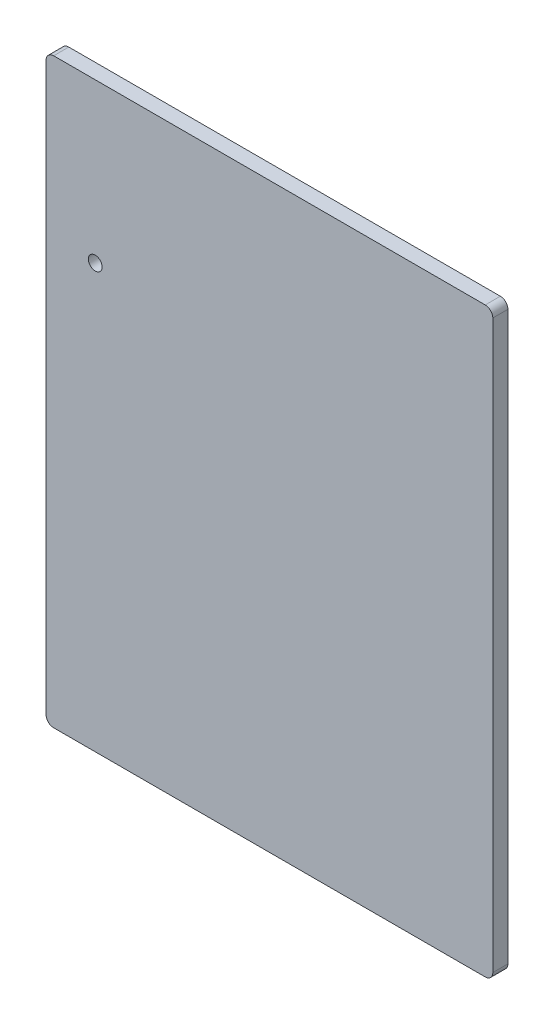
ISO-10303-21;
HEADER;
FILE_DESCRIPTION(('STEP AP214'),'2;1');
FILE_NAME('part.step','',(''),(''),'','','');
FILE_SCHEMA(('AUTOMOTIVE_DESIGN { 1 0 10303 214 1 1 1 1 }'));
ENDSEC;
DATA;
#1=APPLICATION_CONTEXT('core data for automotive mechanical design processes');
#2=APPLICATION_PROTOCOL_DEFINITION('international standard','automotive_design',2000,#1);
#3=PRODUCT_CONTEXT('',#1,'mechanical');
#4=PRODUCT('Part','Part','',(#3));
#5=PRODUCT_RELATED_PRODUCT_CATEGORY('part','',(#4));
#6=PRODUCT_DEFINITION_FORMATION('','',#4);
#7=PRODUCT_DEFINITION_CONTEXT('part definition',#1,'design');
#8=PRODUCT_DEFINITION('design','',#6,#7);
#9=PRODUCT_DEFINITION_SHAPE('','',#8);
#10=(LENGTH_UNIT() NAMED_UNIT(*) SI_UNIT(.MILLI.,.METRE.));
#11=(NAMED_UNIT(*) PLANE_ANGLE_UNIT() SI_UNIT($,.RADIAN.));
#12=(NAMED_UNIT(*) SI_UNIT($,.STERADIAN.) SOLID_ANGLE_UNIT());
#13=UNCERTAINTY_MEASURE_WITH_UNIT(LENGTH_MEASURE(1.E-05),#10,'distance_accuracy_value','');
#14=(GEOMETRIC_REPRESENTATION_CONTEXT(3) GLOBAL_UNCERTAINTY_ASSIGNED_CONTEXT((#13)) GLOBAL_UNIT_ASSIGNED_CONTEXT((#10,
#11,#12)) REPRESENTATION_CONTEXT('',''));
#15=CARTESIAN_POINT('',(0.,0.,0.));
#16=DIRECTION('',(0.,0.,1.));
#17=DIRECTION('',(1.,0.,0.));
#18=AXIS2_PLACEMENT_3D('',#15,#16,#17);
#19=CARTESIAN_POINT('',(-295.5,770.,20.));
#20=DIRECTION('',(1.,0.,0.));
#21=DIRECTION('',(0.,1.,0.));
#22=AXIS2_PLACEMENT_3D('',#19,#20,#21);
#23=PLANE('',#22);
#24=DIRECTION('',(0.,-1.,0.));
#25=VECTOR('',#24,1.);
#26=CARTESIAN_POINT('',(-295.5,770.,20.));
#27=LINE('',#26,#25);
#28=CARTESIAN_POINT('',(-295.5,760.,20.));
#29=VERTEX_POINT('',#28);
#30=CARTESIAN_POINT('',(-295.5,10.,20.));
#31=VERTEX_POINT('',#30);
#32=EDGE_CURVE('E180',#29,#31,#27,.T.);
#33=ORIENTED_EDGE('',*,*,#32,.F.);
#34=DIRECTION('',(0.,0.,-1.));
#35=VECTOR('',#34,1.);
#36=CARTESIAN_POINT('',(-295.5,760.,20.));
#37=LINE('',#36,#35);
#38=CARTESIAN_POINT('',(-295.5,760.,0.));
#39=VERTEX_POINT('',#38);
#40=EDGE_CURVE('E164',#29,#39,#37,.T.);
#41=ORIENTED_EDGE('',*,*,#40,.T.);
#42=DIRECTION('',(0.,-1.,0.));
#43=VECTOR('',#42,1.);
#44=CARTESIAN_POINT('',(-295.5,770.,0.));
#45=LINE('',#44,#43);
#46=CARTESIAN_POINT('',(-295.5,10.,0.));
#47=VERTEX_POINT('',#46);
#48=EDGE_CURVE('E177',#39,#47,#45,.T.);
#49=ORIENTED_EDGE('',*,*,#48,.T.);
#50=DIRECTION('',(0.,0.,-1.));
#51=VECTOR('',#50,1.);
#52=CARTESIAN_POINT('',(-295.5,10.,20.));
#53=LINE('',#52,#51);
#54=EDGE_CURVE('E183',#47,#31,#53,.F.);
#55=ORIENTED_EDGE('',*,*,#54,.T.);
#56=EDGE_LOOP('',(#33,#41,#49,#55));
#57=FACE_BOUND('',#56,.T.);
#58=ADVANCED_FACE('F47',(#57),#23,.F.);
#59=CARTESIAN_POINT('',(-295.5,0.,20.));
#60=DIRECTION('',(0.,1.,0.));
#61=DIRECTION('',(-1.,0.,0.));
#62=AXIS2_PLACEMENT_3D('',#59,#60,#61);
#63=PLANE('',#62);
#64=DIRECTION('',(1.,0.,0.));
#65=VECTOR('',#64,1.);
#66=CARTESIAN_POINT('',(-295.5,0.,0.));
#67=LINE('',#66,#65);
#68=CARTESIAN_POINT('',(-285.5,0.,0.));
#69=VERTEX_POINT('',#68);
#70=CARTESIAN_POINT('',(285.5,1.06727968545692E-13,0.));
#71=VERTEX_POINT('',#70);
#72=EDGE_CURVE('E189',#69,#71,#67,.T.);
#73=ORIENTED_EDGE('',*,*,#72,.T.);
#74=DIRECTION('',(0.,0.,-1.));
#75=VECTOR('',#74,1.);
#76=CARTESIAN_POINT('',(285.5,1.06727968545692E-13,20.));
#77=LINE('',#76,#75);
#78=CARTESIAN_POINT('',(285.5,1.06727968545692E-13,20.));
#79=VERTEX_POINT('',#78);
#80=EDGE_CURVE('E247',#71,#79,#77,.F.);
#81=ORIENTED_EDGE('',*,*,#80,.T.);
#82=DIRECTION('',(1.,0.,0.));
#83=VECTOR('',#82,1.);
#84=CARTESIAN_POINT('',(-295.5,0.,20.));
#85=LINE('',#84,#83);
#86=CARTESIAN_POINT('',(-285.5,0.,20.));
#87=VERTEX_POINT('',#86);
#88=EDGE_CURVE('E310',#87,#79,#85,.T.);
#89=ORIENTED_EDGE('',*,*,#88,.F.);
#90=DIRECTION('',(0.,0.,-1.));
#91=VECTOR('',#90,1.);
#92=CARTESIAN_POINT('',(-285.5,0.,20.));
#93=LINE('',#92,#91);
#94=EDGE_CURVE('E243',#87,#69,#93,.T.);
#95=ORIENTED_EDGE('',*,*,#94,.T.);
#96=EDGE_LOOP('',(#73,#81,#89,#95));
#97=FACE_BOUND('',#96,.T.);
#98=ADVANCED_FACE('F419',(#97),#63,.F.);
#99=CARTESIAN_POINT('',(295.5,770.,20.));
#100=DIRECTION('',(-1.,0.,0.));
#101=DIRECTION('',(0.,-1.,0.));
#102=AXIS2_PLACEMENT_3D('',#99,#100,#101);
#103=PLANE('',#102);
#104=DIRECTION('',(0.,1.,0.));
#105=VECTOR('',#104,1.);
#106=CARTESIAN_POINT('',(295.5,770.,20.));
#107=LINE('',#106,#105);
#108=CARTESIAN_POINT('',(295.5,10.0000000000001,20.));
#109=VERTEX_POINT('',#108);
#110=CARTESIAN_POINT('',(295.5,760.,20.));
#111=VERTEX_POINT('',#110);
#112=EDGE_CURVE('E306',#109,#111,#107,.T.);
#113=ORIENTED_EDGE('',*,*,#112,.F.);
#114=DIRECTION('',(0.,0.,-1.));
#115=VECTOR('',#114,1.);
#116=CARTESIAN_POINT('',(295.5,10.0000000000001,20.));
#117=LINE('',#116,#115);
#118=CARTESIAN_POINT('',(295.5,10.0000000000001,0.));
#119=VERTEX_POINT('',#118);
#120=EDGE_CURVE('E239',#109,#119,#117,.T.);
#121=ORIENTED_EDGE('',*,*,#120,.T.);
#122=DIRECTION('',(0.,1.,0.));
#123=VECTOR('',#122,1.);
#124=CARTESIAN_POINT('',(295.5,770.,0.));
#125=LINE('',#124,#123);
#126=CARTESIAN_POINT('',(295.5,760.,0.));
#127=VERTEX_POINT('',#126);
#128=EDGE_CURVE('E195',#119,#127,#125,.T.);
#129=ORIENTED_EDGE('',*,*,#128,.T.);
#130=DIRECTION('',(0.,0.,-1.));
#131=VECTOR('',#130,1.);
#132=CARTESIAN_POINT('',(295.5,760.,20.));
#133=LINE('',#132,#131);
#134=EDGE_CURVE('E236',#127,#111,#133,.F.);
#135=ORIENTED_EDGE('',*,*,#134,.T.);
#136=EDGE_LOOP('',(#113,#121,#129,#135));
#137=FACE_BOUND('',#136,.T.);
#138=ADVANCED_FACE('F424',(#137),#103,.F.);
#139=CARTESIAN_POINT('',(-295.5,770.,20.));
#140=DIRECTION('',(0.,-1.,0.));
#141=DIRECTION('',(1.,0.,0.));
#142=AXIS2_PLACEMENT_3D('',#139,#140,#141);
#143=PLANE('',#142);
#144=DIRECTION('',(-1.,0.,0.));
#145=VECTOR('',#144,1.);
#146=CARTESIAN_POINT('',(-295.5,770.,0.));
#147=LINE('',#146,#145);
#148=CARTESIAN_POINT('',(285.5,770.,0.));
#149=VERTEX_POINT('',#148);
#150=CARTESIAN_POINT('',(-285.5,770.,0.));
#151=VERTEX_POINT('',#150);
#152=EDGE_CURVE('E208',#149,#151,#147,.T.);
#153=ORIENTED_EDGE('',*,*,#152,.T.);
#154=DIRECTION('',(0.,0.,-1.));
#155=VECTOR('',#154,1.);
#156=CARTESIAN_POINT('',(-285.5,770.,20.));
#157=LINE('',#156,#155);
#158=CARTESIAN_POINT('',(-285.5,770.,20.));
#159=VERTEX_POINT('',#158);
#160=EDGE_CURVE('E165',#151,#159,#157,.F.);
#161=ORIENTED_EDGE('',*,*,#160,.T.);
#162=DIRECTION('',(-1.,0.,0.));
#163=VECTOR('',#162,1.);
#164=CARTESIAN_POINT('',(-295.5,770.,20.));
#165=LINE('',#164,#163);
#166=CARTESIAN_POINT('',(285.5,770.,20.));
#167=VERTEX_POINT('',#166);
#168=EDGE_CURVE('E202',#167,#159,#165,.T.);
#169=ORIENTED_EDGE('',*,*,#168,.F.);
#170=DIRECTION('',(0.,0.,-1.));
#171=VECTOR('',#170,1.);
#172=CARTESIAN_POINT('',(285.5,770.,20.));
#173=LINE('',#172,#171);
#174=EDGE_CURVE('E171',#167,#149,#173,.T.);
#175=ORIENTED_EDGE('',*,*,#174,.T.);
#176=EDGE_LOOP('',(#153,#161,#169,#175));
#177=FACE_BOUND('',#176,.T.);
#178=ADVANCED_FACE('F600',(#177),#143,.F.);
#179=CARTESIAN_POINT('',(0.,0.,20.));
#180=DIRECTION('',(0.,0.,1.));
#181=DIRECTION('',(1.,0.,0.));
#182=AXIS2_PLACEMENT_3D('',#179,#180,#181);
#183=PLANE('',#182);
#184=CARTESIAN_POINT('',(-230.5,560.,20.));
#185=DIRECTION('',(0.,0.,1.));
#186=DIRECTION('',(1.,0.,0.));
#187=AXIS2_PLACEMENT_3D('',#184,#185,#186);
#188=CIRCLE('',#187,9.10000000000002);
#189=CARTESIAN_POINT('',(-221.4,560.,20.));
#190=VERTEX_POINT('',#189);
#191=EDGE_CURVE('E190',#190,#190,#188,.T.);
#192=ORIENTED_EDGE('',*,*,#191,.F.);
#193=EDGE_LOOP('',(#192));
#194=FACE_BOUND('',#193,.T.);
#195=ORIENTED_EDGE('',*,*,#168,.T.);
#196=CARTESIAN_POINT('',(-285.5,760.,20.));
#197=DIRECTION('',(0.,0.,1.));
#198=DIRECTION('',(1.,0.,0.));
#199=AXIS2_PLACEMENT_3D('',#196,#197,#198);
#200=CIRCLE('',#199,10.);
#201=EDGE_CURVE('E233',#159,#29,#200,.T.);
#202=ORIENTED_EDGE('',*,*,#201,.T.);
#203=ORIENTED_EDGE('',*,*,#32,.T.);
#204=CARTESIAN_POINT('',(-285.5,10.,20.));
#205=DIRECTION('',(0.,0.,1.));
#206=DIRECTION('',(1.,0.,0.));
#207=AXIS2_PLACEMENT_3D('',#204,#205,#206);
#208=CIRCLE('',#207,10.);
#209=EDGE_CURVE('E227',#31,#87,#208,.T.);
#210=ORIENTED_EDGE('',*,*,#209,.T.);
#211=ORIENTED_EDGE('',*,*,#88,.T.);
#212=CARTESIAN_POINT('',(285.5,10.0000000000001,20.));
#213=DIRECTION('',(0.,0.,1.));
#214=DIRECTION('',(1.,0.,0.));
#215=AXIS2_PLACEMENT_3D('',#212,#213,#214);
#216=CIRCLE('',#215,10.);
#217=EDGE_CURVE('E230',#79,#109,#216,.T.);
#218=ORIENTED_EDGE('',*,*,#217,.T.);
#219=ORIENTED_EDGE('',*,*,#112,.T.);
#220=CARTESIAN_POINT('',(285.5,760.,20.));
#221=DIRECTION('',(0.,0.,1.));
#222=DIRECTION('',(1.,0.,0.));
#223=AXIS2_PLACEMENT_3D('',#220,#221,#222);
#224=CIRCLE('',#223,10.);
#225=EDGE_CURVE('E224',#111,#167,#224,.T.);
#226=ORIENTED_EDGE('',*,*,#225,.T.);
#227=EDGE_LOOP('',(#195,#202,#203,#210,#211,#218,#219,#226));
#228=FACE_BOUND('',#227,.T.);
#229=ADVANCED_FACE('F591',(#194,#228),#183,.T.);
#230=CARTESIAN_POINT('',(0.,0.,0.));
#231=DIRECTION('',(0.,0.,1.));
#232=DIRECTION('',(1.,0.,0.));
#233=AXIS2_PLACEMENT_3D('',#230,#231,#232);
#234=PLANE('',#233);
#235=DIRECTION('',(-1.,0.,0.));
#236=VECTOR('',#235,1.);
#237=CARTESIAN_POINT('',(215.5,29.9999999999999,0.));
#238=LINE('',#237,#236);
#239=CARTESIAN_POINT('',(199.5,29.9999999999999,0.));
#240=VERTEX_POINT('',#239);
#241=CARTESIAN_POINT('',(-199.5,30.,0.));
#242=VERTEX_POINT('',#241);
#243=EDGE_CURVE('E360',#240,#242,#238,.T.);
#244=ORIENTED_EDGE('',*,*,#243,.F.);
#245=CARTESIAN_POINT('',(199.5,45.9999999999999,0.));
#246=DIRECTION('',(0.,0.,1.));
#247=DIRECTION('',(1.,0.,0.));
#248=AXIS2_PLACEMENT_3D('',#245,#246,#247);
#249=CIRCLE('',#248,16.);
#250=CARTESIAN_POINT('',(215.5,45.9999999999999,0.));
#251=VERTEX_POINT('',#250);
#252=EDGE_CURVE('E56',#240,#251,#249,.T.);
#253=ORIENTED_EDGE('',*,*,#252,.T.);
#254=DIRECTION('',(0.,-1.,0.));
#255=VECTOR('',#254,1.);
#256=CARTESIAN_POINT('',(215.5,740.,0.));
#257=LINE('',#256,#255);
#258=CARTESIAN_POINT('',(215.5,724.,0.));
#259=VERTEX_POINT('',#258);
#260=EDGE_CURVE('E364',#259,#251,#257,.T.);
#261=ORIENTED_EDGE('',*,*,#260,.F.);
#262=CARTESIAN_POINT('',(199.5,724.,0.));
#263=DIRECTION('',(0.,0.,1.));
#264=DIRECTION('',(1.,0.,0.));
#265=AXIS2_PLACEMENT_3D('',#262,#263,#264);
#266=CIRCLE('',#265,16.);
#267=CARTESIAN_POINT('',(199.5,740.,0.));
#268=VERTEX_POINT('',#267);
#269=EDGE_CURVE('E11',#259,#268,#266,.T.);
#270=ORIENTED_EDGE('',*,*,#269,.T.);
#271=DIRECTION('',(1.,0.,0.));
#272=VECTOR('',#271,1.);
#273=CARTESIAN_POINT('',(215.5,740.,0.));
#274=LINE('',#273,#272);
#275=CARTESIAN_POINT('',(-199.5,740.,0.));
#276=VERTEX_POINT('',#275);
#277=EDGE_CURVE('E351',#276,#268,#274,.T.);
#278=ORIENTED_EDGE('',*,*,#277,.F.);
#279=CARTESIAN_POINT('',(-199.5,724.,0.));
#280=DIRECTION('',(0.,0.,1.));
#281=DIRECTION('',(1.,0.,0.));
#282=AXIS2_PLACEMENT_3D('',#279,#280,#281);
#283=CIRCLE('',#282,16.);
#284=CARTESIAN_POINT('',(-215.5,724.,0.));
#285=VERTEX_POINT('',#284);
#286=EDGE_CURVE('E292',#276,#285,#283,.T.);
#287=ORIENTED_EDGE('',*,*,#286,.T.);
#288=DIRECTION('',(0.,1.,0.));
#289=VECTOR('',#288,1.);
#290=CARTESIAN_POINT('',(-215.5,740.,0.));
#291=LINE('',#290,#289);
#292=CARTESIAN_POINT('',(-215.5,45.9999999999999,0.));
#293=VERTEX_POINT('',#292);
#294=EDGE_CURVE('E356',#293,#285,#291,.T.);
#295=ORIENTED_EDGE('',*,*,#294,.F.);
#296=CARTESIAN_POINT('',(-199.5,45.9999999999999,0.));
#297=DIRECTION('',(0.,0.,1.));
#298=DIRECTION('',(1.,0.,0.));
#299=AXIS2_PLACEMENT_3D('',#296,#297,#298);
#300=CIRCLE('',#299,16.);
#301=EDGE_CURVE('E289',#293,#242,#300,.T.);
#302=ORIENTED_EDGE('',*,*,#301,.T.);
#303=EDGE_LOOP('',(#244,#253,#261,#270,#278,#287,#295,#302));
#304=FACE_BOUND('',#303,.T.);
#305=CARTESIAN_POINT('',(265.5,700.000000000002,0.));
#306=DIRECTION('',(0.,0.,-1.));
#307=DIRECTION('',(-1.,0.,0.));
#308=AXIS2_PLACEMENT_3D('',#305,#306,#307);
#309=CIRCLE('',#308,20.1);
#310=CARTESIAN_POINT('',(245.4,700.000000000002,0.));
#311=VERTEX_POINT('',#310);
#312=EDGE_CURVE('E344',#311,#311,#309,.T.);
#313=ORIENTED_EDGE('',*,*,#312,.F.);
#314=EDGE_LOOP('',(#313));
#315=FACE_BOUND('',#314,.T.);
#316=CARTESIAN_POINT('',(265.5,310.,0.));
#317=DIRECTION('',(0.,0.,-1.));
#318=DIRECTION('',(-1.,0.,0.));
#319=AXIS2_PLACEMENT_3D('',#316,#317,#318);
#320=CIRCLE('',#319,20.1);
#321=CARTESIAN_POINT('',(245.4,310.,0.));
#322=VERTEX_POINT('',#321);
#323=EDGE_CURVE('E340',#322,#322,#320,.T.);
#324=ORIENTED_EDGE('',*,*,#323,.F.);
#325=EDGE_LOOP('',(#324));
#326=FACE_BOUND('',#325,.T.);
#327=CARTESIAN_POINT('',(265.5,100.,0.));
#328=DIRECTION('',(0.,0.,-1.));
#329=DIRECTION('',(-1.,0.,0.));
#330=AXIS2_PLACEMENT_3D('',#327,#328,#329);
#331=CIRCLE('',#330,20.1);
#332=CARTESIAN_POINT('',(245.4,100.,0.));
#333=VERTEX_POINT('',#332);
#334=EDGE_CURVE('E331',#333,#333,#331,.T.);
#335=ORIENTED_EDGE('',*,*,#334,.F.);
#336=EDGE_LOOP('',(#335));
#337=FACE_BOUND('',#336,.T.);
#338=CARTESIAN_POINT('',(-230.5,560.,0.));
#339=DIRECTION('',(0.,0.,1.));
#340=DIRECTION('',(1.,0.,0.));
#341=AXIS2_PLACEMENT_3D('',#338,#339,#340);
#342=CIRCLE('',#341,9.10000000000002);
#343=CARTESIAN_POINT('',(-221.4,560.,0.));
#344=VERTEX_POINT('',#343);
#345=EDGE_CURVE('E199',#344,#344,#342,.T.);
#346=ORIENTED_EDGE('',*,*,#345,.T.);
#347=EDGE_LOOP('',(#346));
#348=FACE_BOUND('',#347,.T.);
#349=ORIENTED_EDGE('',*,*,#48,.F.);
#350=CARTESIAN_POINT('',(-285.5,760.,0.));
#351=DIRECTION('',(0.,0.,1.));
#352=DIRECTION('',(1.,0.,0.));
#353=AXIS2_PLACEMENT_3D('',#350,#351,#352);
#354=CIRCLE('',#353,10.);
#355=EDGE_CURVE('E160',#39,#151,#354,.F.);
#356=ORIENTED_EDGE('',*,*,#355,.T.);
#357=ORIENTED_EDGE('',*,*,#152,.F.);
#358=CARTESIAN_POINT('',(285.5,760.,0.));
#359=DIRECTION('',(0.,0.,1.));
#360=DIRECTION('',(1.,0.,0.));
#361=AXIS2_PLACEMENT_3D('',#358,#359,#360);
#362=CIRCLE('',#361,10.);
#363=EDGE_CURVE('E182',#149,#127,#362,.F.);
#364=ORIENTED_EDGE('',*,*,#363,.T.);
#365=ORIENTED_EDGE('',*,*,#128,.F.);
#366=CARTESIAN_POINT('',(285.5,10.0000000000001,0.));
#367=DIRECTION('',(0.,0.,1.));
#368=DIRECTION('',(1.,0.,0.));
#369=AXIS2_PLACEMENT_3D('',#366,#367,#368);
#370=CIRCLE('',#369,10.);
#371=EDGE_CURVE('E172',#119,#71,#370,.F.);
#372=ORIENTED_EDGE('',*,*,#371,.T.);
#373=ORIENTED_EDGE('',*,*,#72,.F.);
#374=CARTESIAN_POINT('',(-285.5,10.,0.));
#375=DIRECTION('',(0.,0.,1.));
#376=DIRECTION('',(1.,0.,0.));
#377=AXIS2_PLACEMENT_3D('',#374,#375,#376);
#378=CIRCLE('',#377,10.);
#379=EDGE_CURVE('E187',#69,#47,#378,.F.);
#380=ORIENTED_EDGE('',*,*,#379,.T.);
#381=EDGE_LOOP('',(#349,#356,#357,#364,#365,#372,#373,#380));
#382=FACE_BOUND('',#381,.T.);
#383=ADVANCED_FACE('F185',(#304,#315,#326,#337,#348,#382),#234,.F.);
#384=CARTESIAN_POINT('',(-230.5,560.,0.));
#385=DIRECTION('',(0.,0.,1.));
#386=DIRECTION('',(1.,0.,0.));
#387=AXIS2_PLACEMENT_3D('',#384,#385,#386);
#388=CYLINDRICAL_SURFACE('',#387,9.10000000000002);
#389=ORIENTED_EDGE('',*,*,#191,.T.);
#390=EDGE_LOOP('',(#389));
#391=FACE_BOUND('',#390,.T.);
#392=ORIENTED_EDGE('',*,*,#345,.F.);
#393=EDGE_LOOP('',(#392));
#394=FACE_BOUND('',#393,.T.);
#395=ADVANCED_FACE('F432',(#391,#394),#388,.F.);
#396=CARTESIAN_POINT('',(-285.5,760.,20.));
#397=DIRECTION('',(0.,0.,-1.));
#398=DIRECTION('',(-1.,0.,0.));
#399=AXIS2_PLACEMENT_3D('',#396,#397,#398);
#400=CYLINDRICAL_SURFACE('',#399,10.);
#401=ORIENTED_EDGE('',*,*,#201,.F.);
#402=ORIENTED_EDGE('',*,*,#160,.F.);
#403=ORIENTED_EDGE('',*,*,#355,.F.);
#404=ORIENTED_EDGE('',*,*,#40,.F.);
#405=EDGE_LOOP('',(#401,#402,#403,#404));
#406=FACE_BOUND('',#405,.T.);
#407=ADVANCED_FACE('F163',(#406),#400,.T.);
#408=CARTESIAN_POINT('',(285.5,10.0000000000001,20.));
#409=DIRECTION('',(0.,0.,-1.));
#410=DIRECTION('',(-1.,0.,0.));
#411=AXIS2_PLACEMENT_3D('',#408,#409,#410);
#412=CYLINDRICAL_SURFACE('',#411,10.);
#413=ORIENTED_EDGE('',*,*,#217,.F.);
#414=ORIENTED_EDGE('',*,*,#80,.F.);
#415=ORIENTED_EDGE('',*,*,#371,.F.);
#416=ORIENTED_EDGE('',*,*,#120,.F.);
#417=EDGE_LOOP('',(#413,#414,#415,#416));
#418=FACE_BOUND('',#417,.T.);
#419=ADVANCED_FACE('F431',(#418),#412,.T.);
#420=CARTESIAN_POINT('',(-285.5,10.,20.));
#421=DIRECTION('',(0.,0.,-1.));
#422=DIRECTION('',(-1.,0.,0.));
#423=AXIS2_PLACEMENT_3D('',#420,#421,#422);
#424=CYLINDRICAL_SURFACE('',#423,10.);
#425=ORIENTED_EDGE('',*,*,#209,.F.);
#426=ORIENTED_EDGE('',*,*,#54,.F.);
#427=ORIENTED_EDGE('',*,*,#379,.F.);
#428=ORIENTED_EDGE('',*,*,#94,.F.);
#429=EDGE_LOOP('',(#425,#426,#427,#428));
#430=FACE_BOUND('',#429,.T.);
#431=ADVANCED_FACE('F435',(#430),#424,.T.);
#432=CARTESIAN_POINT('',(285.5,760.,20.));
#433=DIRECTION('',(0.,0.,-1.));
#434=DIRECTION('',(-1.,0.,0.));
#435=AXIS2_PLACEMENT_3D('',#432,#433,#434);
#436=CYLINDRICAL_SURFACE('',#435,10.);
#437=ORIENTED_EDGE('',*,*,#225,.F.);
#438=ORIENTED_EDGE('',*,*,#134,.F.);
#439=ORIENTED_EDGE('',*,*,#363,.F.);
#440=ORIENTED_EDGE('',*,*,#174,.F.);
#441=EDGE_LOOP('',(#437,#438,#439,#440));
#442=FACE_BOUND('',#441,.T.);
#443=ADVANCED_FACE('F439',(#442),#436,.T.);
#444=CARTESIAN_POINT('',(265.5,100.,15.));
#445=DIRECTION('',(0.,0.,-1.));
#446=DIRECTION('',(-1.,0.,0.));
#447=AXIS2_PLACEMENT_3D('',#444,#445,#446);
#448=CYLINDRICAL_SURFACE('',#447,20.1);
#449=CARTESIAN_POINT('',(265.5,100.,15.));
#450=DIRECTION('',(0.,0.,-1.));
#451=DIRECTION('',(-1.,0.,0.));
#452=AXIS2_PLACEMENT_3D('',#449,#450,#451);
#453=CIRCLE('',#452,20.1);
#454=CARTESIAN_POINT('',(245.4,100.,15.));
#455=VERTEX_POINT('',#454);
#456=EDGE_CURVE('E327',#455,#455,#453,.T.);
#457=ORIENTED_EDGE('',*,*,#456,.F.);
#458=EDGE_LOOP('',(#457));
#459=FACE_BOUND('',#458,.T.);
#460=ORIENTED_EDGE('',*,*,#334,.T.);
#461=EDGE_LOOP('',(#460));
#462=FACE_BOUND('',#461,.T.);
#463=ADVANCED_FACE('F443',(#459,#462),#448,.F.);
#464=CARTESIAN_POINT('',(265.5,100.,15.));
#465=DIRECTION('',(0.,0.,-1.));
#466=DIRECTION('',(-1.,0.,0.));
#467=AXIS2_PLACEMENT_3D('',#464,#465,#466);
#468=PLANE('',#467);
#469=ORIENTED_EDGE('',*,*,#456,.T.);
#470=EDGE_LOOP('',(#469));
#471=FACE_BOUND('',#470,.T.);
#472=ADVANCED_FACE('F538',(#471),#468,.T.);
#473=CARTESIAN_POINT('',(265.5,310.,15.));
#474=DIRECTION('',(0.,0.,-1.));
#475=DIRECTION('',(-1.,0.,0.));
#476=AXIS2_PLACEMENT_3D('',#473,#474,#475);
#477=CYLINDRICAL_SURFACE('',#476,20.1);
#478=CARTESIAN_POINT('',(265.5,310.,15.));
#479=DIRECTION('',(0.,0.,-1.));
#480=DIRECTION('',(-1.,0.,0.));
#481=AXIS2_PLACEMENT_3D('',#478,#479,#480);
#482=CIRCLE('',#481,20.1);
#483=CARTESIAN_POINT('',(245.4,310.,15.));
#484=VERTEX_POINT('',#483);
#485=EDGE_CURVE('E336',#484,#484,#482,.T.);
#486=ORIENTED_EDGE('',*,*,#485,.F.);
#487=EDGE_LOOP('',(#486));
#488=FACE_BOUND('',#487,.T.);
#489=ORIENTED_EDGE('',*,*,#323,.T.);
#490=EDGE_LOOP('',(#489));
#491=FACE_BOUND('',#490,.T.);
#492=ADVANCED_FACE('F529',(#488,#491),#477,.F.);
#493=CARTESIAN_POINT('',(265.5,310.,15.));
#494=DIRECTION('',(0.,0.,-1.));
#495=DIRECTION('',(-1.,0.,0.));
#496=AXIS2_PLACEMENT_3D('',#493,#494,#495);
#497=PLANE('',#496);
#498=ORIENTED_EDGE('',*,*,#485,.T.);
#499=EDGE_LOOP('',(#498));
#500=FACE_BOUND('',#499,.T.);
#501=ADVANCED_FACE('F520',(#500),#497,.T.);
#502=CARTESIAN_POINT('',(265.5,700.000000000002,15.));
#503=DIRECTION('',(0.,0.,-1.));
#504=DIRECTION('',(-1.,0.,0.));
#505=AXIS2_PLACEMENT_3D('',#502,#503,#504);
#506=CYLINDRICAL_SURFACE('',#505,20.1);
#507=CARTESIAN_POINT('',(265.5,700.000000000002,15.));
#508=DIRECTION('',(0.,0.,-1.));
#509=DIRECTION('',(-1.,0.,0.));
#510=AXIS2_PLACEMENT_3D('',#507,#508,#509);
#511=CIRCLE('',#510,20.1);
#512=CARTESIAN_POINT('',(245.4,700.000000000002,15.));
#513=VERTEX_POINT('',#512);
#514=EDGE_CURVE('E326',#513,#513,#511,.T.);
#515=ORIENTED_EDGE('',*,*,#514,.F.);
#516=EDGE_LOOP('',(#515));
#517=FACE_BOUND('',#516,.T.);
#518=ORIENTED_EDGE('',*,*,#312,.T.);
#519=EDGE_LOOP('',(#518));
#520=FACE_BOUND('',#519,.T.);
#521=ADVANCED_FACE('F511',(#517,#520),#506,.F.);
#522=CARTESIAN_POINT('',(265.5,700.000000000002,15.));
#523=DIRECTION('',(0.,0.,-1.));
#524=DIRECTION('',(-1.,0.,0.));
#525=AXIS2_PLACEMENT_3D('',#522,#523,#524);
#526=PLANE('',#525);
#527=ORIENTED_EDGE('',*,*,#514,.T.);
#528=EDGE_LOOP('',(#527));
#529=FACE_BOUND('',#528,.T.);
#530=ADVANCED_FACE('F503',(#529),#526,.T.);
#531=CARTESIAN_POINT('',(215.5,740.,5.));
#532=DIRECTION('',(1.,0.,0.));
#533=DIRECTION('',(0.,0.,-1.));
#534=AXIS2_PLACEMENT_3D('',#531,#532,#533);
#535=PLANE('',#534);
#536=ORIENTED_EDGE('',*,*,#260,.T.);
#537=DIRECTION('',(0.,0.,-1.));
#538=VECTOR('',#537,1.);
#539=CARTESIAN_POINT('',(215.5,45.9999999999999,5.));
#540=LINE('',#539,#538);
#541=CARTESIAN_POINT('',(215.5,45.9999999999999,5.));
#542=VERTEX_POINT('',#541);
#543=EDGE_CURVE('E286',#251,#542,#540,.F.);
#544=ORIENTED_EDGE('',*,*,#543,.T.);
#545=DIRECTION('',(0.,-1.,0.));
#546=VECTOR('',#545,1.);
#547=CARTESIAN_POINT('',(215.5,740.,5.));
#548=LINE('',#547,#546);
#549=CARTESIAN_POINT('',(215.5,724.,5.));
#550=VERTEX_POINT('',#549);
#551=EDGE_CURVE('E355',#550,#542,#548,.T.);
#552=ORIENTED_EDGE('',*,*,#551,.F.);
#553=DIRECTION('',(0.,0.,-1.));
#554=VECTOR('',#553,1.);
#555=CARTESIAN_POINT('',(215.5,724.,0.));
#556=LINE('',#555,#554);
#557=EDGE_CURVE('E283',#550,#259,#556,.T.);
#558=ORIENTED_EDGE('',*,*,#557,.T.);
#559=EDGE_LOOP('',(#536,#544,#552,#558));
#560=FACE_BOUND('',#559,.T.);
#561=ADVANCED_FACE('F413',(#560),#535,.F.);
#562=CARTESIAN_POINT('',(215.5,740.,5.));
#563=DIRECTION('',(0.,1.,0.));
#564=DIRECTION('',(0.,0.,1.));
#565=AXIS2_PLACEMENT_3D('',#562,#563,#564);
#566=PLANE('',#565);
#567=DIRECTION('',(1.,0.,0.));
#568=VECTOR('',#567,1.);
#569=CARTESIAN_POINT('',(215.5,740.,5.));
#570=LINE('',#569,#568);
#571=CARTESIAN_POINT('',(-199.5,740.,5.));
#572=VERTEX_POINT('',#571);
#573=CARTESIAN_POINT('',(199.5,740.,5.));
#574=VERTEX_POINT('',#573);
#575=EDGE_CURVE('E332',#572,#574,#570,.T.);
#576=ORIENTED_EDGE('',*,*,#575,.F.);
#577=DIRECTION('',(0.,0.,-1.));
#578=VECTOR('',#577,1.);
#579=CARTESIAN_POINT('',(-199.5,740.,0.));
#580=LINE('',#579,#578);
#581=EDGE_CURVE('E279',#572,#276,#580,.T.);
#582=ORIENTED_EDGE('',*,*,#581,.T.);
#583=ORIENTED_EDGE('',*,*,#277,.T.);
#584=DIRECTION('',(0.,0.,-1.));
#585=VECTOR('',#584,1.);
#586=CARTESIAN_POINT('',(199.5,740.,5.));
#587=LINE('',#586,#585);
#588=EDGE_CURVE('E276',#268,#574,#587,.F.);
#589=ORIENTED_EDGE('',*,*,#588,.T.);
#590=EDGE_LOOP('',(#576,#582,#583,#589));
#591=FACE_BOUND('',#590,.T.);
#592=ADVANCED_FACE('F412',(#591),#566,.F.);
#593=CARTESIAN_POINT('',(-215.5,740.,5.));
#594=DIRECTION('',(-1.,0.,0.));
#595=DIRECTION('',(0.,-1.,0.));
#596=AXIS2_PLACEMENT_3D('',#593,#594,#595);
#597=PLANE('',#596);
#598=DIRECTION('',(0.,1.,0.));
#599=VECTOR('',#598,1.);
#600=CARTESIAN_POINT('',(-215.5,740.,5.));
#601=LINE('',#600,#599);
#602=CARTESIAN_POINT('',(-215.5,45.9999999999999,5.));
#603=VERTEX_POINT('',#602);
#604=CARTESIAN_POINT('',(-215.5,724.,5.));
#605=VERTEX_POINT('',#604);
#606=EDGE_CURVE('E370',#603,#605,#601,.T.);
#607=ORIENTED_EDGE('',*,*,#606,.F.);
#608=DIRECTION('',(0.,0.,-1.));
#609=VECTOR('',#608,1.);
#610=CARTESIAN_POINT('',(-215.5,45.9999999999999,0.));
#611=LINE('',#610,#609);
#612=EDGE_CURVE('E253',#603,#293,#611,.T.);
#613=ORIENTED_EDGE('',*,*,#612,.T.);
#614=ORIENTED_EDGE('',*,*,#294,.T.);
#615=DIRECTION('',(0.,0.,-1.));
#616=VECTOR('',#615,1.);
#617=CARTESIAN_POINT('',(-215.5,724.,5.));
#618=LINE('',#617,#616);
#619=EDGE_CURVE('E250',#285,#605,#618,.F.);
#620=ORIENTED_EDGE('',*,*,#619,.T.);
#621=EDGE_LOOP('',(#607,#613,#614,#620));
#622=FACE_BOUND('',#621,.T.);
#623=ADVANCED_FACE('F403',(#622),#597,.F.);
#624=CARTESIAN_POINT('',(215.5,29.9999999999999,5.));
#625=DIRECTION('',(0.,-1.,0.));
#626=DIRECTION('',(1.,0.,0.));
#627=AXIS2_PLACEMENT_3D('',#624,#625,#626);
#628=PLANE('',#627);
#629=ORIENTED_EDGE('',*,*,#243,.T.);
#630=DIRECTION('',(0.,0.,-1.));
#631=VECTOR('',#630,1.);
#632=CARTESIAN_POINT('',(-199.5,30.,5.));
#633=LINE('',#632,#631);
#634=CARTESIAN_POINT('',(-199.5,30.,5.));
#635=VERTEX_POINT('',#634);
#636=EDGE_CURVE('E261',#242,#635,#633,.F.);
#637=ORIENTED_EDGE('',*,*,#636,.T.);
#638=DIRECTION('',(-1.,0.,0.));
#639=VECTOR('',#638,1.);
#640=CARTESIAN_POINT('',(215.5,29.9999999999999,5.));
#641=LINE('',#640,#639);
#642=CARTESIAN_POINT('',(199.5,29.9999999999999,5.));
#643=VERTEX_POINT('',#642);
#644=EDGE_CURVE('E374',#643,#635,#641,.T.);
#645=ORIENTED_EDGE('',*,*,#644,.F.);
#646=DIRECTION('',(0.,0.,-1.));
#647=VECTOR('',#646,1.);
#648=CARTESIAN_POINT('',(199.5,29.9999999999999,0.));
#649=LINE('',#648,#647);
#650=EDGE_CURVE('E257',#643,#240,#649,.T.);
#651=ORIENTED_EDGE('',*,*,#650,.T.);
#652=EDGE_LOOP('',(#629,#637,#645,#651));
#653=FACE_BOUND('',#652,.T.);
#654=ADVANCED_FACE('F393',(#653),#628,.F.);
#655=CARTESIAN_POINT('',(0.,0.,5.));
#656=DIRECTION('',(0.,0.,-1.));
#657=DIRECTION('',(-1.,0.,0.));
#658=AXIS2_PLACEMENT_3D('',#655,#656,#657);
#659=PLANE('',#658);
#660=ORIENTED_EDGE('',*,*,#644,.T.);
#661=CARTESIAN_POINT('',(-199.5,45.9999999999999,5.));
#662=DIRECTION('',(0.,0.,-1.));
#663=DIRECTION('',(-1.,0.,0.));
#664=AXIS2_PLACEMENT_3D('',#661,#662,#663);
#665=CIRCLE('',#664,16.);
#666=EDGE_CURVE('E273',#635,#603,#665,.T.);
#667=ORIENTED_EDGE('',*,*,#666,.T.);
#668=ORIENTED_EDGE('',*,*,#606,.T.);
#669=CARTESIAN_POINT('',(-199.5,724.,5.));
#670=DIRECTION('',(0.,0.,-1.));
#671=DIRECTION('',(-1.,0.,0.));
#672=AXIS2_PLACEMENT_3D('',#669,#670,#671);
#673=CIRCLE('',#672,16.);
#674=EDGE_CURVE('E270',#605,#572,#673,.T.);
#675=ORIENTED_EDGE('',*,*,#674,.T.);
#676=ORIENTED_EDGE('',*,*,#575,.T.);
#677=CARTESIAN_POINT('',(199.5,724.,5.));
#678=DIRECTION('',(0.,0.,-1.));
#679=DIRECTION('',(-1.,0.,0.));
#680=AXIS2_PLACEMENT_3D('',#677,#678,#679);
#681=CIRCLE('',#680,16.);
#682=EDGE_CURVE('E264',#574,#550,#681,.T.);
#683=ORIENTED_EDGE('',*,*,#682,.T.);
#684=ORIENTED_EDGE('',*,*,#551,.T.);
#685=CARTESIAN_POINT('',(199.5,45.9999999999999,5.));
#686=DIRECTION('',(0.,0.,-1.));
#687=DIRECTION('',(-1.,0.,0.));
#688=AXIS2_PLACEMENT_3D('',#685,#686,#687);
#689=CIRCLE('',#688,16.);
#690=EDGE_CURVE('E267',#542,#643,#689,.T.);
#691=ORIENTED_EDGE('',*,*,#690,.T.);
#692=EDGE_LOOP('',(#660,#667,#668,#675,#676,#683,#684,#691));
#693=FACE_BOUND('',#692,.T.);
#694=ADVANCED_FACE('F384',(#693),#659,.T.);
#695=CARTESIAN_POINT('',(-199.5,45.9999999999999,5.));
#696=DIRECTION('',(0.,0.,1.));
#697=DIRECTION('',(1.,0.,0.));
#698=AXIS2_PLACEMENT_3D('',#695,#696,#697);
#699=CYLINDRICAL_SURFACE('',#698,16.);
#700=ORIENTED_EDGE('',*,*,#666,.F.);
#701=ORIENTED_EDGE('',*,*,#636,.F.);
#702=ORIENTED_EDGE('',*,*,#301,.F.);
#703=ORIENTED_EDGE('',*,*,#612,.F.);
#704=EDGE_LOOP('',(#700,#701,#702,#703));
#705=FACE_BOUND('',#704,.T.);
#706=ADVANCED_FACE('F400',(#705),#699,.F.);
#707=CARTESIAN_POINT('',(-199.5,724.,5.));
#708=DIRECTION('',(0.,0.,1.));
#709=DIRECTION('',(1.,0.,0.));
#710=AXIS2_PLACEMENT_3D('',#707,#708,#709);
#711=CYLINDRICAL_SURFACE('',#710,16.);
#712=ORIENTED_EDGE('',*,*,#674,.F.);
#713=ORIENTED_EDGE('',*,*,#619,.F.);
#714=ORIENTED_EDGE('',*,*,#286,.F.);
#715=ORIENTED_EDGE('',*,*,#581,.F.);
#716=EDGE_LOOP('',(#712,#713,#714,#715));
#717=FACE_BOUND('',#716,.T.);
#718=ADVANCED_FACE('F409',(#717),#711,.F.);
#719=CARTESIAN_POINT('',(199.5,45.9999999999999,5.));
#720=DIRECTION('',(0.,0.,1.));
#721=DIRECTION('',(1.,0.,0.));
#722=AXIS2_PLACEMENT_3D('',#719,#720,#721);
#723=CYLINDRICAL_SURFACE('',#722,16.);
#724=ORIENTED_EDGE('',*,*,#690,.F.);
#725=ORIENTED_EDGE('',*,*,#543,.F.);
#726=ORIENTED_EDGE('',*,*,#252,.F.);
#727=ORIENTED_EDGE('',*,*,#650,.F.);
#728=EDGE_LOOP('',(#724,#725,#726,#727));
#729=FACE_BOUND('',#728,.T.);
#730=ADVANCED_FACE('F391',(#729),#723,.F.);
#731=CARTESIAN_POINT('',(199.5,724.,5.));
#732=DIRECTION('',(0.,0.,1.));
#733=DIRECTION('',(1.,0.,0.));
#734=AXIS2_PLACEMENT_3D('',#731,#732,#733);
#735=CYLINDRICAL_SURFACE('',#734,16.);
#736=ORIENTED_EDGE('',*,*,#682,.F.);
#737=ORIENTED_EDGE('',*,*,#588,.F.);
#738=ORIENTED_EDGE('',*,*,#269,.F.);
#739=ORIENTED_EDGE('',*,*,#557,.F.);
#740=EDGE_LOOP('',(#736,#737,#738,#739));
#741=FACE_BOUND('',#740,.T.);
#742=ADVANCED_FACE('F49',(#741),#735,.F.);
#743=CLOSED_SHELL('',(#58,#98,#138,#178,#229,#383,#395,#407,#419,#431,#443,#463,#472,#492,#501,
#521,#530,#561,#592,#623,#654,#694,#706,#718,#730,#742));
#744=MANIFOLD_SOLID_BREP('B2',#743);
#745=ADVANCED_BREP_SHAPE_REPRESENTATION('',(#18,#744),#14);
#746=SHAPE_DEFINITION_REPRESENTATION(#9,#745);
ENDSEC;
END-ISO-10303-21;
